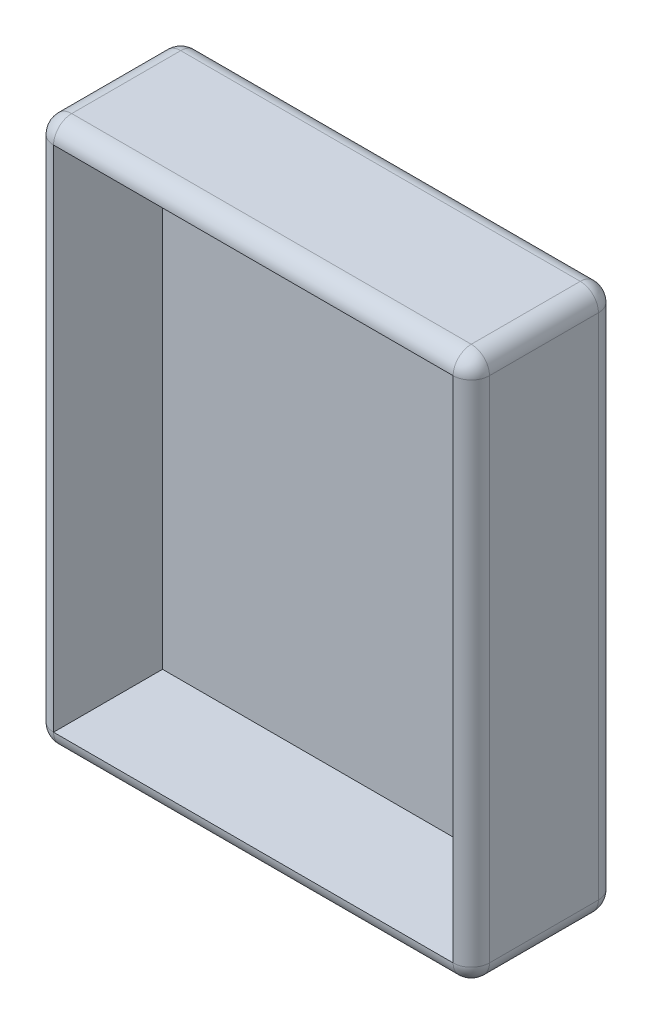
ISO-10303-21;
HEADER;
FILE_DESCRIPTION(('STEP AP214'),'2;1');
FILE_NAME('part.step','',(''),(''),'','','');
FILE_SCHEMA(('AUTOMOTIVE_DESIGN { 1 0 10303 214 1 1 1 1 }'));
ENDSEC;
DATA;
#1=APPLICATION_CONTEXT('core data for automotive mechanical design processes');
#2=APPLICATION_PROTOCOL_DEFINITION('international standard','automotive_design',2000,#1);
#3=PRODUCT_CONTEXT('',#1,'mechanical');
#4=PRODUCT('Part','Part','',(#3));
#5=PRODUCT_RELATED_PRODUCT_CATEGORY('part','',(#4));
#6=PRODUCT_DEFINITION_FORMATION('','',#4);
#7=PRODUCT_DEFINITION_CONTEXT('part definition',#1,'design');
#8=PRODUCT_DEFINITION('design','',#6,#7);
#9=PRODUCT_DEFINITION_SHAPE('','',#8);
#10=(LENGTH_UNIT() NAMED_UNIT(*) SI_UNIT(.MILLI.,.METRE.));
#11=(NAMED_UNIT(*) PLANE_ANGLE_UNIT() SI_UNIT($,.RADIAN.));
#12=(NAMED_UNIT(*) SI_UNIT($,.STERADIAN.) SOLID_ANGLE_UNIT());
#13=UNCERTAINTY_MEASURE_WITH_UNIT(LENGTH_MEASURE(1.E-05),#10,'distance_accuracy_value','');
#14=(GEOMETRIC_REPRESENTATION_CONTEXT(3) GLOBAL_UNCERTAINTY_ASSIGNED_CONTEXT((#13)) GLOBAL_UNIT_ASSIGNED_CONTEXT((#10,
#11,#12)) REPRESENTATION_CONTEXT('',''));
#15=CARTESIAN_POINT('',(0.,0.,0.));
#16=DIRECTION('',(0.,0.,1.));
#17=DIRECTION('',(1.,0.,0.));
#18=AXIS2_PLACEMENT_3D('',#15,#16,#17);
#19=CARTESIAN_POINT('',(32.0703589256002,121.164250059425,40.));
#20=DIRECTION('',(-1.,0.,0.));
#21=DIRECTION('',(0.,-1.,0.));
#22=AXIS2_PLACEMENT_3D('',#19,#20,#21);
#23=PLANE('',#22);
#24=DIRECTION('',(0.,0.,-1.));
#25=VECTOR('',#24,1.);
#26=CARTESIAN_POINT('',(32.0703589256002,116.164250059425,40.));
#27=LINE('',#26,#25);
#28=CARTESIAN_POINT('',(32.0703589256002,116.164250059425,5.));
#29=VERTEX_POINT('',#28);
#30=CARTESIAN_POINT('',(32.0703589256002,116.164250059425,35.));
#31=VERTEX_POINT('',#30);
#32=EDGE_CURVE('E209',#29,#31,#27,.F.);
#33=ORIENTED_EDGE('',*,*,#32,.T.);
#34=DIRECTION('',(0.,1.,0.));
#35=VECTOR('',#34,1.);
#36=CARTESIAN_POINT('',(32.0703589256003,-28.8357499405752,35.));
#37=LINE('',#36,#35);
#38=CARTESIAN_POINT('',(32.0703589256003,-23.8357499405752,35.));
#39=VERTEX_POINT('',#38);
#40=EDGE_CURVE('E215',#31,#39,#37,.F.);
#41=ORIENTED_EDGE('',*,*,#40,.T.);
#42=DIRECTION('',(0.,0.,-1.));
#43=VECTOR('',#42,1.);
#44=CARTESIAN_POINT('',(32.0703589256003,-23.8357499405752,40.));
#45=LINE('',#44,#43);
#46=CARTESIAN_POINT('',(32.0703589256003,-23.8357499405752,5.));
#47=VERTEX_POINT('',#46);
#48=EDGE_CURVE('E213',#39,#47,#45,.T.);
#49=ORIENTED_EDGE('',*,*,#48,.T.);
#50=DIRECTION('',(0.,1.,0.));
#51=VECTOR('',#50,1.);
#52=CARTESIAN_POINT('',(32.0703589256002,121.164250059425,5.));
#53=LINE('',#52,#51);
#54=EDGE_CURVE('E211',#47,#29,#53,.T.);
#55=ORIENTED_EDGE('',*,*,#54,.T.);
#56=EDGE_LOOP('',(#33,#41,#49,#55));
#57=FACE_BOUND('',#56,.T.);
#58=ADVANCED_FACE('F35',(#57),#23,.F.);
#59=CARTESIAN_POINT('',(-87.9296410743998,121.164250059425,40.));
#60=DIRECTION('',(0.,-1.,0.));
#61=DIRECTION('',(0.,0.,-1.));
#62=AXIS2_PLACEMENT_3D('',#59,#60,#61);
#63=PLANE('',#62);
#64=DIRECTION('',(-1.,0.,0.));
#65=VECTOR('',#64,1.);
#66=CARTESIAN_POINT('',(-87.9296410743998,121.164250059425,5.));
#67=LINE('',#66,#65);
#68=CARTESIAN_POINT('',(27.0703589256002,121.164250059425,5.));
#69=VERTEX_POINT('',#68);
#70=CARTESIAN_POINT('',(-82.9296410743998,121.164250059425,5.));
#71=VERTEX_POINT('',#70);
#72=EDGE_CURVE('E202',#69,#71,#67,.T.);
#73=ORIENTED_EDGE('',*,*,#72,.T.);
#74=DIRECTION('',(0.,0.,-1.));
#75=VECTOR('',#74,1.);
#76=CARTESIAN_POINT('',(-82.9296410743998,121.164250059425,40.));
#77=LINE('',#76,#75);
#78=CARTESIAN_POINT('',(-82.9296410743998,121.164250059425,35.));
#79=VERTEX_POINT('',#78);
#80=EDGE_CURVE('E207',#71,#79,#77,.F.);
#81=ORIENTED_EDGE('',*,*,#80,.T.);
#82=DIRECTION('',(-1.,0.,0.));
#83=VECTOR('',#82,1.);
#84=CARTESIAN_POINT('',(32.0703589256002,121.164250059425,35.));
#85=LINE('',#84,#83);
#86=CARTESIAN_POINT('',(27.0703589256002,121.164250059425,35.));
#87=VERTEX_POINT('',#86);
#88=EDGE_CURVE('E204',#79,#87,#85,.F.);
#89=ORIENTED_EDGE('',*,*,#88,.T.);
#90=DIRECTION('',(0.,0.,-1.));
#91=VECTOR('',#90,1.);
#92=CARTESIAN_POINT('',(27.0703589256002,121.164250059425,40.));
#93=LINE('',#92,#91);
#94=EDGE_CURVE('E200',#87,#69,#93,.T.);
#95=ORIENTED_EDGE('',*,*,#94,.T.);
#96=EDGE_LOOP('',(#73,#81,#89,#95));
#97=FACE_BOUND('',#96,.T.);
#98=ADVANCED_FACE('F312',(#97),#63,.F.);
#99=CARTESIAN_POINT('',(-87.9296410743998,121.164250059425,40.));
#100=DIRECTION('',(1.,0.,0.));
#101=DIRECTION('',(0.,1.,0.));
#102=AXIS2_PLACEMENT_3D('',#99,#100,#101);
#103=PLANE('',#102);
#104=DIRECTION('',(0.,0.,-1.));
#105=VECTOR('',#104,1.);
#106=CARTESIAN_POINT('',(-87.9296410743998,-23.8357499405752,40.));
#107=LINE('',#106,#105);
#108=CARTESIAN_POINT('',(-87.9296410743998,-23.8357499405752,5.));
#109=VERTEX_POINT('',#108);
#110=CARTESIAN_POINT('',(-87.9296410743998,-23.8357499405752,35.));
#111=VERTEX_POINT('',#110);
#112=EDGE_CURVE('E195',#109,#111,#107,.F.);
#113=ORIENTED_EDGE('',*,*,#112,.T.);
#114=DIRECTION('',(0.,-1.,0.));
#115=VECTOR('',#114,1.);
#116=CARTESIAN_POINT('',(-87.9296410743998,121.164250059425,35.));
#117=LINE('',#116,#115);
#118=CARTESIAN_POINT('',(-87.9296410743998,116.164250059425,35.));
#119=VERTEX_POINT('',#118);
#120=EDGE_CURVE('E197',#111,#119,#117,.F.);
#121=ORIENTED_EDGE('',*,*,#120,.T.);
#122=DIRECTION('',(0.,0.,-1.));
#123=VECTOR('',#122,1.);
#124=CARTESIAN_POINT('',(-87.9296410743998,116.164250059425,40.));
#125=LINE('',#124,#123);
#126=CARTESIAN_POINT('',(-87.9296410743998,116.164250059425,5.));
#127=VERTEX_POINT('',#126);
#128=EDGE_CURVE('E191',#119,#127,#125,.T.);
#129=ORIENTED_EDGE('',*,*,#128,.T.);
#130=DIRECTION('',(0.,-1.,0.));
#131=VECTOR('',#130,1.);
#132=CARTESIAN_POINT('',(-87.9296410743998,121.164250059425,5.));
#133=LINE('',#132,#131);
#134=EDGE_CURVE('E193',#127,#109,#133,.T.);
#135=ORIENTED_EDGE('',*,*,#134,.T.);
#136=EDGE_LOOP('',(#113,#121,#129,#135));
#137=FACE_BOUND('',#136,.T.);
#138=ADVANCED_FACE('F303',(#137),#103,.F.);
#139=CARTESIAN_POINT('',(-87.9296410743998,-28.8357499405752,40.));
#140=DIRECTION('',(0.,1.,0.));
#141=DIRECTION('',(0.,0.,1.));
#142=AXIS2_PLACEMENT_3D('',#139,#140,#141);
#143=PLANE('',#142);
#144=DIRECTION('',(0.,0.,-1.));
#145=VECTOR('',#144,1.);
#146=CARTESIAN_POINT('',(27.0703589256003,-28.8357499405752,40.));
#147=LINE('',#146,#145);
#148=CARTESIAN_POINT('',(27.0703589256003,-28.8357499405752,5.));
#149=VERTEX_POINT('',#148);
#150=CARTESIAN_POINT('',(27.0703589256003,-28.8357499405752,35.));
#151=VERTEX_POINT('',#150);
#152=EDGE_CURVE('E184',#149,#151,#147,.F.);
#153=ORIENTED_EDGE('',*,*,#152,.T.);
#154=DIRECTION('',(1.,0.,0.));
#155=VECTOR('',#154,1.);
#156=CARTESIAN_POINT('',(-87.9296410743998,-28.8357499405752,35.));
#157=LINE('',#156,#155);
#158=CARTESIAN_POINT('',(-82.9296410743998,-28.8357499405752,35.));
#159=VERTEX_POINT('',#158);
#160=EDGE_CURVE('E188',#151,#159,#157,.F.);
#161=ORIENTED_EDGE('',*,*,#160,.T.);
#162=DIRECTION('',(0.,0.,-1.));
#163=VECTOR('',#162,1.);
#164=CARTESIAN_POINT('',(-82.9296410743998,-28.8357499405752,40.));
#165=LINE('',#164,#163);
#166=CARTESIAN_POINT('',(-82.9296410743998,-28.8357499405752,5.));
#167=VERTEX_POINT('',#166);
#168=EDGE_CURVE('E186',#159,#167,#165,.T.);
#169=ORIENTED_EDGE('',*,*,#168,.T.);
#170=DIRECTION('',(1.,0.,0.));
#171=VECTOR('',#170,1.);
#172=CARTESIAN_POINT('',(-87.9296410743998,-28.8357499405752,5.));
#173=LINE('',#172,#171);
#174=EDGE_CURVE('E182',#167,#149,#173,.T.);
#175=ORIENTED_EDGE('',*,*,#174,.T.);
#176=EDGE_LOOP('',(#153,#161,#169,#175));
#177=FACE_BOUND('',#176,.T.);
#178=ADVANCED_FACE('F333',(#177),#143,.F.);
#179=CARTESIAN_POINT('',(0.,0.,0.));
#180=DIRECTION('',(0.,0.,1.));
#181=DIRECTION('',(1.,0.,0.));
#182=AXIS2_PLACEMENT_3D('',#179,#180,#181);
#183=PLANE('',#182);
#184=DIRECTION('',(-1.,0.,0.));
#185=VECTOR('',#184,1.);
#186=CARTESIAN_POINT('',(0.,116.164250059425,0.));
#187=LINE('',#186,#185);
#188=CARTESIAN_POINT('',(-82.9296410743998,116.164250059425,0.));
#189=VERTEX_POINT('',#188);
#190=CARTESIAN_POINT('',(27.0703589256002,116.164250059425,0.));
#191=VERTEX_POINT('',#190);
#192=EDGE_CURVE('E218',#189,#191,#187,.F.);
#193=ORIENTED_EDGE('',*,*,#192,.T.);
#194=DIRECTION('',(0.,1.,0.));
#195=VECTOR('',#194,1.);
#196=CARTESIAN_POINT('',(27.0703589256002,0.,0.));
#197=LINE('',#196,#195);
#198=CARTESIAN_POINT('',(27.0703589256003,-23.8357499405752,0.));
#199=VERTEX_POINT('',#198);
#200=EDGE_CURVE('E11',#191,#199,#197,.F.);
#201=ORIENTED_EDGE('',*,*,#200,.T.);
#202=DIRECTION('',(1.,0.,0.));
#203=VECTOR('',#202,1.);
#204=CARTESIAN_POINT('',(0.,-23.8357499405752,0.));
#205=LINE('',#204,#203);
#206=CARTESIAN_POINT('',(-82.9296410743998,-23.8357499405752,0.));
#207=VERTEX_POINT('',#206);
#208=EDGE_CURVE('E44',#199,#207,#205,.F.);
#209=ORIENTED_EDGE('',*,*,#208,.T.);
#210=DIRECTION('',(0.,-1.,0.));
#211=VECTOR('',#210,1.);
#212=CARTESIAN_POINT('',(-82.9296410743998,0.,0.));
#213=LINE('',#212,#211);
#214=EDGE_CURVE('E220',#207,#189,#213,.F.);
#215=ORIENTED_EDGE('',*,*,#214,.T.);
#216=EDGE_LOOP('',(#193,#201,#209,#215));
#217=FACE_BOUND('',#216,.T.);
#218=ADVANCED_FACE('F331',(#217),#183,.F.);
#219=CARTESIAN_POINT('',(-87.9296410743998,116.164250059425,5.));
#220=DIRECTION('',(-1.,0.,0.));
#221=DIRECTION('',(0.,0.,1.));
#222=AXIS2_PLACEMENT_3D('',#219,#220,#221);
#223=CYLINDRICAL_SURFACE('',#222,5.);
#224=CARTESIAN_POINT('',(-82.9296410743998,116.164250059425,5.));
#225=DIRECTION('',(-1.,0.,0.));
#226=DIRECTION('',(0.,0.,1.));
#227=AXIS2_PLACEMENT_3D('',#224,#225,#226);
#228=CIRCLE('',#227,5.);
#229=EDGE_CURVE('E39',#71,#189,#228,.T.);
#230=ORIENTED_EDGE('',*,*,#229,.F.);
#231=ORIENTED_EDGE('',*,*,#72,.F.);
#232=CARTESIAN_POINT('',(27.0703589256002,116.164250059425,5.));
#233=DIRECTION('',(1.,0.,0.));
#234=DIRECTION('',(0.,1.,0.));
#235=AXIS2_PLACEMENT_3D('',#232,#233,#234);
#236=CIRCLE('',#235,5.);
#237=EDGE_CURVE('E280',#191,#69,#236,.T.);
#238=ORIENTED_EDGE('',*,*,#237,.F.);
#239=ORIENTED_EDGE('',*,*,#192,.F.);
#240=EDGE_LOOP('',(#230,#231,#238,#239));
#241=FACE_BOUND('',#240,.T.);
#242=ADVANCED_FACE('F37',(#241),#223,.T.);
#243=CARTESIAN_POINT('',(-82.9296410743998,116.164250059425,5.));
#244=DIRECTION('',(0.,0.,1.));
#245=DIRECTION('',(1.,0.,0.));
#246=AXIS2_PLACEMENT_3D('',#243,#244,#245);
#247=SPHERICAL_SURFACE('',#246,5.);
#248=CARTESIAN_POINT('',(-82.9296410743998,116.164250059425,5.));
#249=DIRECTION('',(0.,0.,-1.));
#250=DIRECTION('',(-1.,0.,0.));
#251=AXIS2_PLACEMENT_3D('',#248,#249,#250);
#252=CIRCLE('',#251,5.);
#253=EDGE_CURVE('E275',#71,#127,#252,.F.);
#254=ORIENTED_EDGE('',*,*,#253,.F.);
#255=ORIENTED_EDGE('',*,*,#229,.T.);
#256=CARTESIAN_POINT('',(-82.9296410743998,116.164250059425,5.));
#257=DIRECTION('',(0.,1.,0.));
#258=DIRECTION('',(0.,0.,1.));
#259=AXIS2_PLACEMENT_3D('',#256,#257,#258);
#260=CIRCLE('',#259,5.);
#261=EDGE_CURVE('E278',#127,#189,#260,.F.);
#262=ORIENTED_EDGE('',*,*,#261,.F.);
#263=EDGE_LOOP('',(#254,#255,#262));
#264=FACE_BOUND('',#263,.T.);
#265=ADVANCED_FACE('F291',(#264),#247,.T.);
#266=CARTESIAN_POINT('',(27.0703589256002,116.164250059425,5.));
#267=DIRECTION('',(0.,0.,1.));
#268=DIRECTION('',(1.,0.,0.));
#269=AXIS2_PLACEMENT_3D('',#266,#267,#268);
#270=SPHERICAL_SURFACE('',#269,5.);
#271=CARTESIAN_POINT('',(27.0703589256002,116.164250059425,5.));
#272=DIRECTION('',(0.,1.,0.));
#273=DIRECTION('',(0.,0.,1.));
#274=AXIS2_PLACEMENT_3D('',#271,#272,#273);
#275=CIRCLE('',#274,5.);
#276=EDGE_CURVE('E269',#191,#29,#275,.F.);
#277=ORIENTED_EDGE('',*,*,#276,.F.);
#278=ORIENTED_EDGE('',*,*,#237,.T.);
#279=CARTESIAN_POINT('',(27.0703589256002,116.164250059425,5.));
#280=DIRECTION('',(0.,0.,-1.));
#281=DIRECTION('',(-1.,0.,0.));
#282=AXIS2_PLACEMENT_3D('',#279,#280,#281);
#283=CIRCLE('',#282,5.);
#284=EDGE_CURVE('E272',#29,#69,#283,.F.);
#285=ORIENTED_EDGE('',*,*,#284,.F.);
#286=EDGE_LOOP('',(#277,#278,#285));
#287=FACE_BOUND('',#286,.T.);
#288=ADVANCED_FACE('F327',(#287),#270,.T.);
#289=CARTESIAN_POINT('',(-82.9296410743998,121.164250059425,5.));
#290=DIRECTION('',(0.,-1.,0.));
#291=DIRECTION('',(1.,0.,0.));
#292=AXIS2_PLACEMENT_3D('',#289,#290,#291);
#293=CYLINDRICAL_SURFACE('',#292,5.);
#294=ORIENTED_EDGE('',*,*,#261,.T.);
#295=ORIENTED_EDGE('',*,*,#214,.F.);
#296=CARTESIAN_POINT('',(-82.9296410743998,-23.8357499405752,5.));
#297=DIRECTION('',(0.,-1.,0.));
#298=DIRECTION('',(0.,0.,-1.));
#299=AXIS2_PLACEMENT_3D('',#296,#297,#298);
#300=CIRCLE('',#299,5.);
#301=EDGE_CURVE('E263',#109,#207,#300,.T.);
#302=ORIENTED_EDGE('',*,*,#301,.F.);
#303=ORIENTED_EDGE('',*,*,#134,.F.);
#304=EDGE_LOOP('',(#294,#295,#302,#303));
#305=FACE_BOUND('',#304,.T.);
#306=ADVANCED_FACE('F298',(#305),#293,.T.);
#307=CARTESIAN_POINT('',(-82.9296410743998,116.164250059425,40.));
#308=DIRECTION('',(0.,0.,-1.));
#309=DIRECTION('',(-1.,0.,0.));
#310=AXIS2_PLACEMENT_3D('',#307,#308,#309);
#311=CYLINDRICAL_SURFACE('',#310,5.);
#312=ORIENTED_EDGE('',*,*,#253,.T.);
#313=ORIENTED_EDGE('',*,*,#128,.F.);
#314=CARTESIAN_POINT('',(-82.9296410743998,116.164250059425,35.));
#315=DIRECTION('',(0.,0.,1.));
#316=DIRECTION('',(1.,0.,0.));
#317=AXIS2_PLACEMENT_3D('',#314,#315,#316);
#318=CIRCLE('',#317,5.);
#319=EDGE_CURVE('E260',#79,#119,#318,.T.);
#320=ORIENTED_EDGE('',*,*,#319,.F.);
#321=ORIENTED_EDGE('',*,*,#80,.F.);
#322=EDGE_LOOP('',(#312,#313,#320,#321));
#323=FACE_BOUND('',#322,.T.);
#324=ADVANCED_FACE('F309',(#323),#311,.T.);
#325=CARTESIAN_POINT('',(0.,116.164250059425,35.));
#326=DIRECTION('',(1.,0.,0.));
#327=DIRECTION('',(0.,0.,-1.));
#328=AXIS2_PLACEMENT_3D('',#325,#326,#327);
#329=CYLINDRICAL_SURFACE('',#328,5.);
#330=CARTESIAN_POINT('',(27.0703589256002,116.164250059425,35.));
#331=DIRECTION('',(1.,0.,0.));
#332=DIRECTION('',(0.,0.,-1.));
#333=AXIS2_PLACEMENT_3D('',#330,#331,#332);
#334=CIRCLE('',#333,5.);
#335=CARTESIAN_POINT('',(27.0703589256003,116.164250059425,40.));
#336=VERTEX_POINT('',#335);
#337=EDGE_CURVE('E254',#87,#336,#334,.T.);
#338=ORIENTED_EDGE('',*,*,#337,.F.);
#339=ORIENTED_EDGE('',*,*,#88,.F.);
#340=CARTESIAN_POINT('',(-82.9296410743998,116.164250059425,35.));
#341=DIRECTION('',(-1.,0.,0.));
#342=DIRECTION('',(0.,0.,1.));
#343=AXIS2_PLACEMENT_3D('',#340,#341,#342);
#344=CIRCLE('',#343,5.);
#345=CARTESIAN_POINT('',(-82.9296410743998,116.164250059425,40.));
#346=VERTEX_POINT('',#345);
#347=EDGE_CURVE('E257',#346,#79,#344,.T.);
#348=ORIENTED_EDGE('',*,*,#347,.F.);
#349=DIRECTION('',(-1.,0.,0.));
#350=VECTOR('',#349,1.);
#351=CARTESIAN_POINT('',(-87.9296410743998,116.164250059425,40.));
#352=LINE('',#351,#350);
#353=EDGE_CURVE('E176',#336,#346,#352,.T.);
#354=ORIENTED_EDGE('',*,*,#353,.F.);
#355=EDGE_LOOP('',(#338,#339,#348,#354));
#356=FACE_BOUND('',#355,.T.);
#357=ADVANCED_FACE('F316',(#356),#329,.T.);
#358=CARTESIAN_POINT('',(27.0703589256002,116.164250059425,40.));
#359=DIRECTION('',(0.,0.,-1.));
#360=DIRECTION('',(-1.,0.,0.));
#361=AXIS2_PLACEMENT_3D('',#358,#359,#360);
#362=CYLINDRICAL_SURFACE('',#361,5.);
#363=ORIENTED_EDGE('',*,*,#284,.T.);
#364=ORIENTED_EDGE('',*,*,#94,.F.);
#365=CARTESIAN_POINT('',(27.0703589256002,116.164250059425,35.));
#366=DIRECTION('',(0.,0.,1.));
#367=DIRECTION('',(1.,0.,0.));
#368=AXIS2_PLACEMENT_3D('',#365,#366,#367);
#369=CIRCLE('',#368,5.);
#370=EDGE_CURVE('E252',#31,#87,#369,.T.);
#371=ORIENTED_EDGE('',*,*,#370,.F.);
#372=ORIENTED_EDGE('',*,*,#32,.F.);
#373=EDGE_LOOP('',(#363,#364,#371,#372));
#374=FACE_BOUND('',#373,.T.);
#375=ADVANCED_FACE('F324',(#374),#362,.T.);
#376=CARTESIAN_POINT('',(27.0703589256002,121.164250059425,5.));
#377=DIRECTION('',(0.,1.,0.));
#378=DIRECTION('',(-1.,0.,0.));
#379=AXIS2_PLACEMENT_3D('',#376,#377,#378);
#380=CYLINDRICAL_SURFACE('',#379,5.);
#381=ORIENTED_EDGE('',*,*,#276,.T.);
#382=ORIENTED_EDGE('',*,*,#54,.F.);
#383=CARTESIAN_POINT('',(27.0703589256003,-23.8357499405752,5.));
#384=DIRECTION('',(0.,-1.,0.));
#385=DIRECTION('',(1.,0.,0.));
#386=AXIS2_PLACEMENT_3D('',#383,#384,#385);
#387=CIRCLE('',#386,5.);
#388=EDGE_CURVE('E250',#199,#47,#387,.T.);
#389=ORIENTED_EDGE('',*,*,#388,.F.);
#390=ORIENTED_EDGE('',*,*,#200,.F.);
#391=EDGE_LOOP('',(#381,#382,#389,#390));
#392=FACE_BOUND('',#391,.T.);
#393=ADVANCED_FACE('F330',(#392),#380,.T.);
#394=CARTESIAN_POINT('',(-87.9296410743998,-23.8357499405752,5.));
#395=DIRECTION('',(1.,0.,0.));
#396=DIRECTION('',(0.,0.,-1.));
#397=AXIS2_PLACEMENT_3D('',#394,#395,#396);
#398=CYLINDRICAL_SURFACE('',#397,5.);
#399=CARTESIAN_POINT('',(-82.9296410743998,-23.8357499405752,5.));
#400=DIRECTION('',(-1.,0.,0.));
#401=DIRECTION('',(0.,0.,1.));
#402=AXIS2_PLACEMENT_3D('',#399,#400,#401);
#403=CIRCLE('',#402,5.);
#404=EDGE_CURVE('E266',#207,#167,#403,.T.);
#405=ORIENTED_EDGE('',*,*,#404,.F.);
#406=ORIENTED_EDGE('',*,*,#208,.F.);
#407=CARTESIAN_POINT('',(27.0703589256003,-23.8357499405752,5.));
#408=DIRECTION('',(1.,0.,0.));
#409=DIRECTION('',(0.,0.,-1.));
#410=AXIS2_PLACEMENT_3D('',#407,#408,#409);
#411=CIRCLE('',#410,5.);
#412=EDGE_CURVE('E52',#149,#199,#411,.T.);
#413=ORIENTED_EDGE('',*,*,#412,.F.);
#414=ORIENTED_EDGE('',*,*,#174,.F.);
#415=EDGE_LOOP('',(#405,#406,#413,#414));
#416=FACE_BOUND('',#415,.T.);
#417=ADVANCED_FACE('F392',(#416),#398,.T.);
#418=CARTESIAN_POINT('',(-82.9296410743998,-23.8357499405752,5.));
#419=DIRECTION('',(0.,0.,1.));
#420=DIRECTION('',(1.,0.,0.));
#421=AXIS2_PLACEMENT_3D('',#418,#419,#420);
#422=SPHERICAL_SURFACE('',#421,5.);
#423=ORIENTED_EDGE('',*,*,#301,.T.);
#424=ORIENTED_EDGE('',*,*,#404,.T.);
#425=CARTESIAN_POINT('',(-82.9296410743998,-23.8357499405752,5.));
#426=DIRECTION('',(0.,0.,-1.));
#427=DIRECTION('',(-1.,0.,0.));
#428=AXIS2_PLACEMENT_3D('',#425,#426,#427);
#429=CIRCLE('',#428,5.);
#430=EDGE_CURVE('E246',#109,#167,#429,.F.);
#431=ORIENTED_EDGE('',*,*,#430,.F.);
#432=EDGE_LOOP('',(#423,#424,#431));
#433=FACE_BOUND('',#432,.T.);
#434=ADVANCED_FACE('F388',(#433),#422,.T.);
#435=CARTESIAN_POINT('',(-82.9296410743998,116.164250059425,35.));
#436=DIRECTION('',(0.,0.,1.));
#437=DIRECTION('',(1.,0.,0.));
#438=AXIS2_PLACEMENT_3D('',#435,#436,#437);
#439=SPHERICAL_SURFACE('',#438,5.);
#440=ORIENTED_EDGE('',*,*,#347,.T.);
#441=ORIENTED_EDGE('',*,*,#319,.T.);
#442=CARTESIAN_POINT('',(-82.9296410743998,116.164250059425,35.));
#443=DIRECTION('',(0.,1.,0.));
#444=DIRECTION('',(0.,0.,1.));
#445=AXIS2_PLACEMENT_3D('',#442,#443,#444);
#446=CIRCLE('',#445,5.);
#447=EDGE_CURVE('E244',#346,#119,#446,.F.);
#448=ORIENTED_EDGE('',*,*,#447,.F.);
#449=EDGE_LOOP('',(#440,#441,#448));
#450=FACE_BOUND('',#449,.T.);
#451=ADVANCED_FACE('F385',(#450),#439,.T.);
#452=CARTESIAN_POINT('',(27.0703589256002,116.164250059425,35.));
#453=DIRECTION('',(0.,0.,1.));
#454=DIRECTION('',(1.,0.,0.));
#455=AXIS2_PLACEMENT_3D('',#452,#453,#454);
#456=SPHERICAL_SURFACE('',#455,5.);
#457=ORIENTED_EDGE('',*,*,#370,.T.);
#458=ORIENTED_EDGE('',*,*,#337,.T.);
#459=CARTESIAN_POINT('',(27.0703589256002,116.164250059425,35.));
#460=DIRECTION('',(0.,1.,0.));
#461=DIRECTION('',(0.,0.,1.));
#462=AXIS2_PLACEMENT_3D('',#459,#460,#461);
#463=CIRCLE('',#462,5.);
#464=EDGE_CURVE('E241',#31,#336,#463,.F.);
#465=ORIENTED_EDGE('',*,*,#464,.F.);
#466=EDGE_LOOP('',(#457,#458,#465));
#467=FACE_BOUND('',#466,.T.);
#468=ADVANCED_FACE('F382',(#467),#456,.T.);
#469=CARTESIAN_POINT('',(27.0703589256003,-23.8357499405752,5.));
#470=DIRECTION('',(0.,0.,1.));
#471=DIRECTION('',(1.,0.,0.));
#472=AXIS2_PLACEMENT_3D('',#469,#470,#471);
#473=SPHERICAL_SURFACE('',#472,5.);
#474=ORIENTED_EDGE('',*,*,#412,.T.);
#475=ORIENTED_EDGE('',*,*,#388,.T.);
#476=CARTESIAN_POINT('',(27.0703589256003,-23.8357499405752,5.));
#477=DIRECTION('',(0.,0.,-1.));
#478=DIRECTION('',(-1.,0.,0.));
#479=AXIS2_PLACEMENT_3D('',#476,#477,#478);
#480=CIRCLE('',#479,5.);
#481=EDGE_CURVE('E238',#149,#47,#480,.F.);
#482=ORIENTED_EDGE('',*,*,#481,.F.);
#483=EDGE_LOOP('',(#474,#475,#482));
#484=FACE_BOUND('',#483,.T.);
#485=ADVANCED_FACE('F378',(#484),#473,.T.);
#486=CARTESIAN_POINT('',(-82.9296410743998,-23.8357499405752,40.));
#487=DIRECTION('',(0.,0.,-1.));
#488=DIRECTION('',(-1.,0.,0.));
#489=AXIS2_PLACEMENT_3D('',#486,#487,#488);
#490=CYLINDRICAL_SURFACE('',#489,5.);
#491=ORIENTED_EDGE('',*,*,#430,.T.);
#492=ORIENTED_EDGE('',*,*,#168,.F.);
#493=CARTESIAN_POINT('',(-82.9296410743998,-23.8357499405752,35.));
#494=DIRECTION('',(0.,0.,1.));
#495=DIRECTION('',(1.,0.,0.));
#496=AXIS2_PLACEMENT_3D('',#493,#494,#495);
#497=CIRCLE('',#496,5.);
#498=EDGE_CURVE('E235',#111,#159,#497,.T.);
#499=ORIENTED_EDGE('',*,*,#498,.F.);
#500=ORIENTED_EDGE('',*,*,#112,.F.);
#501=EDGE_LOOP('',(#491,#492,#499,#500));
#502=FACE_BOUND('',#501,.T.);
#503=ADVANCED_FACE('F374',(#502),#490,.T.);
#504=CARTESIAN_POINT('',(-82.9296410743998,0.,35.));
#505=DIRECTION('',(0.,1.,0.));
#506=DIRECTION('',(-1.,0.,0.));
#507=AXIS2_PLACEMENT_3D('',#504,#505,#506);
#508=CYLINDRICAL_SURFACE('',#507,5.);
#509=ORIENTED_EDGE('',*,*,#447,.T.);
#510=ORIENTED_EDGE('',*,*,#120,.F.);
#511=CARTESIAN_POINT('',(-82.9296410743998,-23.8357499405752,35.));
#512=DIRECTION('',(0.,-1.,0.));
#513=DIRECTION('',(0.,0.,-1.));
#514=AXIS2_PLACEMENT_3D('',#511,#512,#513);
#515=CIRCLE('',#514,5.);
#516=CARTESIAN_POINT('',(-82.9296410743998,-23.8357499405752,40.));
#517=VERTEX_POINT('',#516);
#518=EDGE_CURVE('E232',#517,#111,#515,.T.);
#519=ORIENTED_EDGE('',*,*,#518,.F.);
#520=DIRECTION('',(0.,-1.,0.));
#521=VECTOR('',#520,1.);
#522=CARTESIAN_POINT('',(-82.9296410743998,-28.8357499405752,40.));
#523=LINE('',#522,#521);
#524=EDGE_CURVE('E146',#346,#517,#523,.T.);
#525=ORIENTED_EDGE('',*,*,#524,.F.);
#526=EDGE_LOOP('',(#509,#510,#519,#525));
#527=FACE_BOUND('',#526,.T.);
#528=ADVANCED_FACE('F370',(#527),#508,.T.);
#529=CARTESIAN_POINT('',(27.0703589256002,0.,35.));
#530=DIRECTION('',(0.,-1.,0.));
#531=DIRECTION('',(1.,0.,0.));
#532=AXIS2_PLACEMENT_3D('',#529,#530,#531);
#533=CYLINDRICAL_SURFACE('',#532,5.);
#534=ORIENTED_EDGE('',*,*,#464,.T.);
#535=DIRECTION('',(0.,1.,0.));
#536=VECTOR('',#535,1.);
#537=CARTESIAN_POINT('',(27.0703589256002,121.164250059425,40.));
#538=LINE('',#537,#536);
#539=CARTESIAN_POINT('',(27.0703589256003,-23.8357499405752,40.));
#540=VERTEX_POINT('',#539);
#541=EDGE_CURVE('E173',#540,#336,#538,.T.);
#542=ORIENTED_EDGE('',*,*,#541,.F.);
#543=CARTESIAN_POINT('',(27.0703589256003,-23.8357499405752,35.));
#544=DIRECTION('',(0.,-1.,0.));
#545=DIRECTION('',(0.,0.,-1.));
#546=AXIS2_PLACEMENT_3D('',#543,#544,#545);
#547=CIRCLE('',#546,5.);
#548=EDGE_CURVE('E229',#39,#540,#547,.T.);
#549=ORIENTED_EDGE('',*,*,#548,.F.);
#550=ORIENTED_EDGE('',*,*,#40,.F.);
#551=EDGE_LOOP('',(#534,#542,#549,#550));
#552=FACE_BOUND('',#551,.T.);
#553=ADVANCED_FACE('F366',(#552),#533,.T.);
#554=CARTESIAN_POINT('',(27.0703589256003,-23.8357499405752,40.));
#555=DIRECTION('',(0.,0.,-1.));
#556=DIRECTION('',(-1.,0.,0.));
#557=AXIS2_PLACEMENT_3D('',#554,#555,#556);
#558=CYLINDRICAL_SURFACE('',#557,5.);
#559=ORIENTED_EDGE('',*,*,#481,.T.);
#560=ORIENTED_EDGE('',*,*,#48,.F.);
#561=CARTESIAN_POINT('',(27.0703589256003,-23.8357499405752,35.));
#562=DIRECTION('',(0.,0.,1.));
#563=DIRECTION('',(1.,0.,0.));
#564=AXIS2_PLACEMENT_3D('',#561,#562,#563);
#565=CIRCLE('',#564,5.);
#566=EDGE_CURVE('E227',#151,#39,#565,.T.);
#567=ORIENTED_EDGE('',*,*,#566,.F.);
#568=ORIENTED_EDGE('',*,*,#152,.F.);
#569=EDGE_LOOP('',(#559,#560,#567,#568));
#570=FACE_BOUND('',#569,.T.);
#571=ADVANCED_FACE('F362',(#570),#558,.T.);
#572=CARTESIAN_POINT('',(-82.9296410743998,-23.8357499405752,35.));
#573=DIRECTION('',(0.,0.,1.));
#574=DIRECTION('',(1.,0.,0.));
#575=AXIS2_PLACEMENT_3D('',#572,#573,#574);
#576=SPHERICAL_SURFACE('',#575,5.);
#577=ORIENTED_EDGE('',*,*,#518,.T.);
#578=ORIENTED_EDGE('',*,*,#498,.T.);
#579=CARTESIAN_POINT('',(-82.9296410743998,-23.8357499405752,35.));
#580=DIRECTION('',(-1.,0.,0.));
#581=DIRECTION('',(0.,0.,1.));
#582=AXIS2_PLACEMENT_3D('',#579,#580,#581);
#583=CIRCLE('',#582,5.);
#584=EDGE_CURVE('E225',#517,#159,#583,.F.);
#585=ORIENTED_EDGE('',*,*,#584,.F.);
#586=EDGE_LOOP('',(#577,#578,#585));
#587=FACE_BOUND('',#586,.T.);
#588=ADVANCED_FACE('F358',(#587),#576,.T.);
#589=CARTESIAN_POINT('',(27.0703589256003,-23.8357499405752,35.));
#590=DIRECTION('',(0.,0.,1.));
#591=DIRECTION('',(1.,0.,0.));
#592=AXIS2_PLACEMENT_3D('',#589,#590,#591);
#593=SPHERICAL_SURFACE('',#592,5.);
#594=ORIENTED_EDGE('',*,*,#566,.T.);
#595=ORIENTED_EDGE('',*,*,#548,.T.);
#596=CARTESIAN_POINT('',(27.0703589256003,-23.8357499405752,35.));
#597=DIRECTION('',(1.,0.,0.));
#598=DIRECTION('',(0.,0.,-1.));
#599=AXIS2_PLACEMENT_3D('',#596,#597,#598);
#600=CIRCLE('',#599,5.);
#601=EDGE_CURVE('E169',#151,#540,#600,.F.);
#602=ORIENTED_EDGE('',*,*,#601,.F.);
#603=EDGE_LOOP('',(#594,#595,#602));
#604=FACE_BOUND('',#603,.T.);
#605=ADVANCED_FACE('F354',(#604),#593,.T.);
#606=CARTESIAN_POINT('',(0.,-23.8357499405752,35.));
#607=DIRECTION('',(-1.,0.,0.));
#608=DIRECTION('',(0.,0.,1.));
#609=AXIS2_PLACEMENT_3D('',#606,#607,#608);
#610=CYLINDRICAL_SURFACE('',#609,5.);
#611=ORIENTED_EDGE('',*,*,#584,.T.);
#612=ORIENTED_EDGE('',*,*,#160,.F.);
#613=ORIENTED_EDGE('',*,*,#601,.T.);
#614=DIRECTION('',(1.,0.,0.));
#615=VECTOR('',#614,1.);
#616=CARTESIAN_POINT('',(32.0703589256003,-23.8357499405752,40.));
#617=LINE('',#616,#615);
#618=EDGE_CURVE('E180',#517,#540,#617,.T.);
#619=ORIENTED_EDGE('',*,*,#618,.F.);
#620=EDGE_LOOP('',(#611,#612,#613,#619));
#621=FACE_BOUND('',#620,.T.);
#622=ADVANCED_FACE('F351',(#621),#610,.T.);
#623=CARTESIAN_POINT('',(-82.9296410743998,116.164250059425,10.));
#624=DIRECTION('',(-1.,0.,0.));
#625=DIRECTION('',(0.,0.,1.));
#626=AXIS2_PLACEMENT_3D('',#623,#624,#625);
#627=PLANE('',#626);
#628=ORIENTED_EDGE('',*,*,#524,.T.);
#629=DIRECTION('',(0.,0.,1.));
#630=VECTOR('',#629,1.);
#631=CARTESIAN_POINT('',(-82.9296410743998,-23.8357499405752,10.));
#632=LINE('',#631,#630);
#633=CARTESIAN_POINT('',(-82.9296410743998,-23.8357499405752,10.));
#634=VERTEX_POINT('',#633);
#635=EDGE_CURVE('E139',#634,#517,#632,.T.);
#636=ORIENTED_EDGE('',*,*,#635,.F.);
#637=DIRECTION('',(0.,-1.,0.));
#638=VECTOR('',#637,1.);
#639=CARTESIAN_POINT('',(-82.9296410743998,116.164250059425,10.));
#640=LINE('',#639,#638);
#641=CARTESIAN_POINT('',(-82.9296410743998,116.164250059425,10.));
#642=VERTEX_POINT('',#641);
#643=EDGE_CURVE('E143',#642,#634,#640,.T.);
#644=ORIENTED_EDGE('',*,*,#643,.F.);
#645=DIRECTION('',(0.,0.,1.));
#646=VECTOR('',#645,1.);
#647=CARTESIAN_POINT('',(-82.9296410743998,116.164250059425,10.));
#648=LINE('',#647,#646);
#649=EDGE_CURVE('E167',#642,#346,#648,.T.);
#650=ORIENTED_EDGE('',*,*,#649,.T.);
#651=EDGE_LOOP('',(#628,#636,#644,#650));
#652=FACE_BOUND('',#651,.T.);
#653=ADVANCED_FACE('F141',(#652),#627,.F.);
#654=CARTESIAN_POINT('',(-82.9296410743998,116.164250059425,10.));
#655=DIRECTION('',(0.,1.,0.));
#656=DIRECTION('',(0.,0.,1.));
#657=AXIS2_PLACEMENT_3D('',#654,#655,#656);
#658=PLANE('',#657);
#659=ORIENTED_EDGE('',*,*,#353,.T.);
#660=ORIENTED_EDGE('',*,*,#649,.F.);
#661=DIRECTION('',(-1.,0.,0.));
#662=VECTOR('',#661,1.);
#663=CARTESIAN_POINT('',(-82.9296410743998,116.164250059425,10.));
#664=LINE('',#663,#662);
#665=CARTESIAN_POINT('',(27.0703589256003,116.164250059425,10.));
#666=VERTEX_POINT('',#665);
#667=EDGE_CURVE('E151',#666,#642,#664,.T.);
#668=ORIENTED_EDGE('',*,*,#667,.F.);
#669=DIRECTION('',(0.,0.,1.));
#670=VECTOR('',#669,1.);
#671=CARTESIAN_POINT('',(27.0703589256003,116.164250059425,10.));
#672=LINE('',#671,#670);
#673=EDGE_CURVE('E170',#666,#336,#672,.T.);
#674=ORIENTED_EDGE('',*,*,#673,.T.);
#675=EDGE_LOOP('',(#659,#660,#668,#674));
#676=FACE_BOUND('',#675,.T.);
#677=ADVANCED_FACE('F508',(#676),#658,.F.);
#678=CARTESIAN_POINT('',(27.0703589256003,116.164250059425,10.));
#679=DIRECTION('',(1.,0.,0.));
#680=DIRECTION('',(0.,0.,-1.));
#681=AXIS2_PLACEMENT_3D('',#678,#679,#680);
#682=PLANE('',#681);
#683=ORIENTED_EDGE('',*,*,#541,.T.);
#684=ORIENTED_EDGE('',*,*,#673,.F.);
#685=DIRECTION('',(0.,1.,0.));
#686=VECTOR('',#685,1.);
#687=CARTESIAN_POINT('',(27.0703589256003,116.164250059425,10.));
#688=LINE('',#687,#686);
#689=CARTESIAN_POINT('',(27.0703589256003,-23.8357499405752,10.));
#690=VERTEX_POINT('',#689);
#691=EDGE_CURVE('E159',#690,#666,#688,.T.);
#692=ORIENTED_EDGE('',*,*,#691,.F.);
#693=DIRECTION('',(0.,0.,1.));
#694=VECTOR('',#693,1.);
#695=CARTESIAN_POINT('',(27.0703589256003,-23.8357499405752,10.));
#696=LINE('',#695,#694);
#697=EDGE_CURVE('E150',#690,#540,#696,.T.);
#698=ORIENTED_EDGE('',*,*,#697,.T.);
#699=EDGE_LOOP('',(#683,#684,#692,#698));
#700=FACE_BOUND('',#699,.T.);
#701=ADVANCED_FACE('F513',(#700),#682,.F.);
#702=CARTESIAN_POINT('',(-82.9296410743998,-23.8357499405752,10.));
#703=DIRECTION('',(0.,-1.,0.));
#704=DIRECTION('',(0.,0.,-1.));
#705=AXIS2_PLACEMENT_3D('',#702,#703,#704);
#706=PLANE('',#705);
#707=ORIENTED_EDGE('',*,*,#618,.T.);
#708=ORIENTED_EDGE('',*,*,#697,.F.);
#709=DIRECTION('',(1.,0.,0.));
#710=VECTOR('',#709,1.);
#711=CARTESIAN_POINT('',(-82.9296410743998,-23.8357499405752,10.));
#712=LINE('',#711,#710);
#713=EDGE_CURVE('E154',#634,#690,#712,.T.);
#714=ORIENTED_EDGE('',*,*,#713,.F.);
#715=ORIENTED_EDGE('',*,*,#635,.T.);
#716=EDGE_LOOP('',(#707,#708,#714,#715));
#717=FACE_BOUND('',#716,.T.);
#718=ADVANCED_FACE('F155',(#717),#706,.F.);
#719=CARTESIAN_POINT('',(0.,0.,10.));
#720=DIRECTION('',(0.,0.,1.));
#721=DIRECTION('',(1.,0.,0.));
#722=AXIS2_PLACEMENT_3D('',#719,#720,#721);
#723=PLANE('',#722);
#724=ORIENTED_EDGE('',*,*,#643,.T.);
#725=ORIENTED_EDGE('',*,*,#713,.T.);
#726=ORIENTED_EDGE('',*,*,#691,.T.);
#727=ORIENTED_EDGE('',*,*,#667,.T.);
#728=EDGE_LOOP('',(#724,#725,#726,#727));
#729=FACE_BOUND('',#728,.T.);
#730=ADVANCED_FACE('F161',(#729),#723,.T.);
#731=CLOSED_SHELL('',(#58,#98,#138,#178,#218,#242,#265,#288,#306,#324,#357,#375,#393,#417,#434,
#451,#468,#485,#503,#528,#553,#571,#588,#605,#622,#653,#677,#701,#718,#730));
#732=MANIFOLD_SOLID_BREP('B2',#731);
#733=ADVANCED_BREP_SHAPE_REPRESENTATION('',(#18,#732),#14);
#734=SHAPE_DEFINITION_REPRESENTATION(#9,#733);
ENDSEC;
END-ISO-10303-21;
